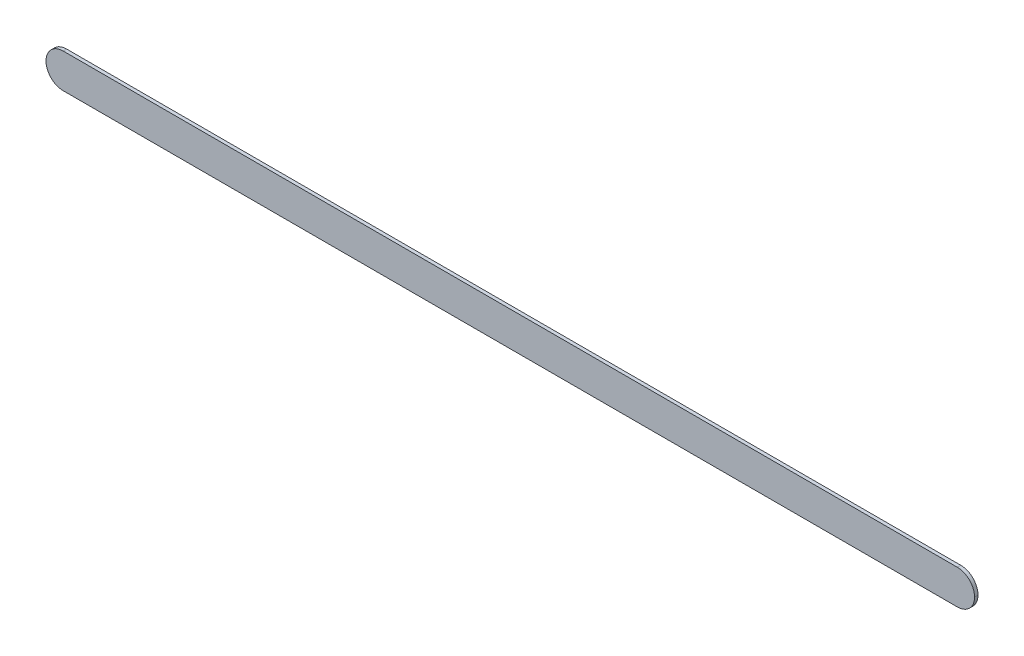
ISO-10303-21;
HEADER;
FILE_DESCRIPTION(('STEP AP214'),'2;1');
FILE_NAME('part.step','',(''),(''),'','','');
FILE_SCHEMA(('AUTOMOTIVE_DESIGN { 1 0 10303 214 1 1 1 1 }'));
ENDSEC;
DATA;
#1=APPLICATION_CONTEXT('core data for automotive mechanical design processes');
#2=APPLICATION_PROTOCOL_DEFINITION('international standard','automotive_design',2000,#1);
#3=PRODUCT_CONTEXT('',#1,'mechanical');
#4=PRODUCT('Part','Part','',(#3));
#5=PRODUCT_RELATED_PRODUCT_CATEGORY('part','',(#4));
#6=PRODUCT_DEFINITION_FORMATION('','',#4);
#7=PRODUCT_DEFINITION_CONTEXT('part definition',#1,'design');
#8=PRODUCT_DEFINITION('design','',#6,#7);
#9=PRODUCT_DEFINITION_SHAPE('','',#8);
#10=(LENGTH_UNIT() NAMED_UNIT(*) SI_UNIT(.MILLI.,.METRE.));
#11=(NAMED_UNIT(*) PLANE_ANGLE_UNIT() SI_UNIT($,.RADIAN.));
#12=(NAMED_UNIT(*) SI_UNIT($,.STERADIAN.) SOLID_ANGLE_UNIT());
#13=UNCERTAINTY_MEASURE_WITH_UNIT(LENGTH_MEASURE(1.E-05),#10,'distance_accuracy_value','');
#14=(GEOMETRIC_REPRESENTATION_CONTEXT(3) GLOBAL_UNCERTAINTY_ASSIGNED_CONTEXT((#13)) GLOBAL_UNIT_ASSIGNED_CONTEXT((#10,
#11,#12)) REPRESENTATION_CONTEXT('',''));
#15=CARTESIAN_POINT('',(0.,0.,0.));
#16=DIRECTION('',(0.,0.,1.));
#17=DIRECTION('',(1.,0.,0.));
#18=AXIS2_PLACEMENT_3D('',#15,#16,#17);
#19=CARTESIAN_POINT('',(16.299999393018,33.765999755859,0.0127));
#20=DIRECTION('',(0.,0.,1.));
#21=DIRECTION('',(1.,0.,0.));
#22=AXIS2_PLACEMENT_3D('',#19,#20,#21);
#23=PLANE('',#22);
#24=CARTESIAN_POINT('',(14.648999023438,33.765999755859,0.0127));
#25=DIRECTION('',(0.,0.,-1.));
#26=DIRECTION('',(1.,0.,0.));
#27=AXIS2_PLACEMENT_3D('',#24,#25,#26);
#28=CIRCLE('',#27,0.06349975587111);
#29=CARTESIAN_POINT('',(14.648999633789,33.7025,0.0127));
#30=VERTEX_POINT('',#29);
#31=CARTESIAN_POINT('',(14.648999023438,33.829499511725,0.0127));
#32=VERTEX_POINT('',#31);
#33=EDGE_CURVE('E112',#30,#32,#28,.T.);
#34=ORIENTED_EDGE('',*,*,#33,.F.);
#35=DIRECTION('',(1.,0.,0.));
#36=VECTOR('',#35,1.);
#37=CARTESIAN_POINT('',(17.950999755859,33.7025,0.0127));
#38=LINE('',#37,#36);
#39=CARTESIAN_POINT('',(17.950999755865,33.7025,0.0127));
#40=VERTEX_POINT('',#39);
#41=EDGE_CURVE('E79',#30,#40,#38,.T.);
#42=ORIENTED_EDGE('',*,*,#41,.T.);
#43=CARTESIAN_POINT('',(17.950999755871,33.765999755859,0.0127));
#44=DIRECTION('',(0.,0.,1.));
#45=DIRECTION('',(1.,0.,0.));
#46=AXIS2_PLACEMENT_3D('',#43,#44,#45);
#47=CIRCLE('',#46,0.06349975585938);
#48=CARTESIAN_POINT('',(18.01449951173,33.765999755859,0.0127));
#49=VERTEX_POINT('',#48);
#50=EDGE_CURVE('E104',#40,#49,#47,.T.);
#51=ORIENTED_EDGE('',*,*,#50,.T.);
#52=CARTESIAN_POINT('',(17.950999755871,33.765999755859,0.0127));
#53=DIRECTION('',(0.,0.,1.));
#54=DIRECTION('',(1.,0.,0.));
#55=AXIS2_PLACEMENT_3D('',#52,#53,#54);
#56=CIRCLE('',#55,0.06349975585938);
#57=CARTESIAN_POINT('',(17.950999755865,33.829499511719,0.0127));
#58=VERTEX_POINT('',#57);
#59=EDGE_CURVE('E83',#49,#58,#56,.T.);
#60=ORIENTED_EDGE('',*,*,#59,.T.);
#61=DIRECTION('',(-1.,0.,0.));
#62=VECTOR('',#61,1.);
#63=CARTESIAN_POINT('',(14.649000244141,33.829499511719,0.0127));
#64=LINE('',#63,#62);
#65=EDGE_CURVE('E11',#58,#32,#64,.T.);
#66=ORIENTED_EDGE('',*,*,#65,.T.);
#67=EDGE_LOOP('',(#34,#42,#51,#60,#66));
#68=FACE_BOUND('',#67,.T.);
#69=ADVANCED_FACE('F17',(#68),#23,.T.);
#70=CARTESIAN_POINT('',(14.649000244141,33.829499511719,0.));
#71=DIRECTION('',(0.,-1.,0.));
#72=DIRECTION('',(0.,0.,-1.));
#73=AXIS2_PLACEMENT_3D('',#70,#71,#72);
#74=PLANE('',#73);
#75=DIRECTION('',(0.,0.,1.));
#76=VECTOR('',#75,1.);
#77=CARTESIAN_POINT('',(17.950999755859,33.829499511719,0.));
#78=LINE('',#77,#76);
#79=CARTESIAN_POINT('',(17.950999755865,33.829499511719,0.));
#80=VERTEX_POINT('',#79);
#81=EDGE_CURVE('E135',#80,#58,#78,.T.);
#82=ORIENTED_EDGE('',*,*,#81,.F.);
#83=DIRECTION('',(-1.,0.,0.));
#84=VECTOR('',#83,1.);
#85=CARTESIAN_POINT('',(16.299999393018,33.829499511719,0.));
#86=LINE('',#85,#84);
#87=CARTESIAN_POINT('',(14.648999023438,33.829499511725,0.));
#88=VERTEX_POINT('',#87);
#89=EDGE_CURVE('E91',#80,#88,#86,.T.);
#90=ORIENTED_EDGE('',*,*,#89,.T.);
#91=DIRECTION('',(0.,0.,-1.));
#92=VECTOR('',#91,1.);
#93=CARTESIAN_POINT('',(14.648999023438,33.829499511731,0.));
#94=LINE('',#93,#92);
#95=EDGE_CURVE('E28',#32,#88,#94,.T.);
#96=ORIENTED_EDGE('',*,*,#95,.F.);
#97=ORIENTED_EDGE('',*,*,#65,.F.);
#98=EDGE_LOOP('',(#82,#90,#96,#97));
#99=FACE_BOUND('',#98,.T.);
#100=ADVANCED_FACE('F150',(#99),#74,.F.);
#101=CARTESIAN_POINT('',(14.648999023438,33.765999755859,0.));
#102=DIRECTION('',(0.,0.,1.));
#103=DIRECTION('',(1.,0.,0.));
#104=AXIS2_PLACEMENT_3D('',#101,#102,#103);
#105=CYLINDRICAL_SURFACE('',#104,0.06349975587111);
#106=DIRECTION('',(0.,0.,1.));
#107=VECTOR('',#106,1.);
#108=CARTESIAN_POINT('',(14.649000244141,33.7025,0.));
#109=LINE('',#108,#107);
#110=CARTESIAN_POINT('',(14.648999633789,33.7025,0.));
#111=VERTEX_POINT('',#110);
#112=EDGE_CURVE('E72',#111,#30,#109,.T.);
#113=ORIENTED_EDGE('',*,*,#112,.T.);
#114=ORIENTED_EDGE('',*,*,#33,.T.);
#115=ORIENTED_EDGE('',*,*,#95,.T.);
#116=CARTESIAN_POINT('',(14.648999023438,33.765999755859,0.));
#117=DIRECTION('',(0.,0.,1.));
#118=DIRECTION('',(1.,0.,0.));
#119=AXIS2_PLACEMENT_3D('',#116,#117,#118);
#120=CIRCLE('',#119,0.06349975587111);
#121=EDGE_CURVE('E86',#88,#111,#120,.T.);
#122=ORIENTED_EDGE('',*,*,#121,.T.);
#123=EDGE_LOOP('',(#113,#114,#115,#122));
#124=FACE_BOUND('',#123,.T.);
#125=ADVANCED_FACE('F19',(#124),#105,.T.);
#126=CARTESIAN_POINT('',(17.950999755859,33.7025,0.));
#127=DIRECTION('',(0.,1.,0.));
#128=DIRECTION('',(1.,0.,0.));
#129=AXIS2_PLACEMENT_3D('',#126,#127,#128);
#130=PLANE('',#129);
#131=ORIENTED_EDGE('',*,*,#112,.F.);
#132=DIRECTION('',(1.,0.,0.));
#133=VECTOR('',#132,1.);
#134=CARTESIAN_POINT('',(16.299999393018,33.7025,0.));
#135=LINE('',#134,#133);
#136=CARTESIAN_POINT('',(17.950999755865,33.7025,0.));
#137=VERTEX_POINT('',#136);
#138=EDGE_CURVE('E77',#111,#137,#135,.T.);
#139=ORIENTED_EDGE('',*,*,#138,.T.);
#140=DIRECTION('',(0.,0.,-1.));
#141=VECTOR('',#140,1.);
#142=CARTESIAN_POINT('',(17.950999755859,33.7025,0.));
#143=LINE('',#142,#141);
#144=EDGE_CURVE('E98',#40,#137,#143,.T.);
#145=ORIENTED_EDGE('',*,*,#144,.F.);
#146=ORIENTED_EDGE('',*,*,#41,.F.);
#147=EDGE_LOOP('',(#131,#139,#145,#146));
#148=FACE_BOUND('',#147,.T.);
#149=ADVANCED_FACE('F74',(#148),#130,.F.);
#150=CARTESIAN_POINT('',(17.950999755871,33.765999755859,0.));
#151=DIRECTION('',(0.,0.,1.));
#152=DIRECTION('',(1.,0.,0.));
#153=AXIS2_PLACEMENT_3D('',#150,#151,#152);
#154=CYLINDRICAL_SURFACE('',#153,0.06349975585938);
#155=DIRECTION('',(0.,0.,1.));
#156=VECTOR('',#155,1.);
#157=CARTESIAN_POINT('',(18.01449951173,33.765999755859,0.));
#158=LINE('',#157,#156);
#159=CARTESIAN_POINT('',(18.01449951173,33.765999755859,0.));
#160=VERTEX_POINT('',#159);
#161=EDGE_CURVE('E21',#160,#49,#158,.T.);
#162=ORIENTED_EDGE('',*,*,#161,.F.);
#163=CARTESIAN_POINT('',(17.950999755871,33.765999755859,0.));
#164=DIRECTION('',(0.,0.,1.));
#165=DIRECTION('',(1.,0.,0.));
#166=AXIS2_PLACEMENT_3D('',#163,#164,#165);
#167=CIRCLE('',#166,0.06349975585938);
#168=EDGE_CURVE('E132',#160,#80,#167,.T.);
#169=ORIENTED_EDGE('',*,*,#168,.T.);
#170=ORIENTED_EDGE('',*,*,#81,.T.);
#171=ORIENTED_EDGE('',*,*,#59,.F.);
#172=EDGE_LOOP('',(#162,#169,#170,#171));
#173=FACE_BOUND('',#172,.T.);
#174=ADVANCED_FACE('F156',(#173),#154,.T.);
#175=CARTESIAN_POINT('',(16.299999393018,33.765999755859,0.));
#176=DIRECTION('',(0.,0.,1.));
#177=DIRECTION('',(1.,0.,0.));
#178=AXIS2_PLACEMENT_3D('',#175,#176,#177);
#179=PLANE('',#178);
#180=ORIENTED_EDGE('',*,*,#138,.F.);
#181=ORIENTED_EDGE('',*,*,#121,.F.);
#182=ORIENTED_EDGE('',*,*,#89,.F.);
#183=ORIENTED_EDGE('',*,*,#168,.F.);
#184=CARTESIAN_POINT('',(17.950999755871,33.765999755859,0.));
#185=DIRECTION('',(0.,0.,1.));
#186=DIRECTION('',(1.,0.,0.));
#187=AXIS2_PLACEMENT_3D('',#184,#185,#186);
#188=CIRCLE('',#187,0.06349975585938);
#189=EDGE_CURVE('E96',#137,#160,#188,.T.);
#190=ORIENTED_EDGE('',*,*,#189,.F.);
#191=EDGE_LOOP('',(#180,#181,#182,#183,#190));
#192=FACE_BOUND('',#191,.T.);
#193=ADVANCED_FACE('F94',(#192),#179,.F.);
#194=CARTESIAN_POINT('',(17.950999755871,33.765999755859,0.));
#195=DIRECTION('',(0.,0.,1.));
#196=DIRECTION('',(1.,0.,0.));
#197=AXIS2_PLACEMENT_3D('',#194,#195,#196);
#198=CYLINDRICAL_SURFACE('',#197,0.06349975585938);
#199=ORIENTED_EDGE('',*,*,#189,.T.);
#200=ORIENTED_EDGE('',*,*,#161,.T.);
#201=ORIENTED_EDGE('',*,*,#50,.F.);
#202=ORIENTED_EDGE('',*,*,#144,.T.);
#203=EDGE_LOOP('',(#199,#200,#201,#202));
#204=FACE_BOUND('',#203,.T.);
#205=ADVANCED_FACE('F123',(#204),#198,.T.);
#206=CLOSED_SHELL('',(#69,#100,#125,#149,#174,#193,#205));
#207=MANIFOLD_SOLID_BREP('B1',#206);
#208=ADVANCED_BREP_SHAPE_REPRESENTATION('',(#18,#207),#14);
#209=SHAPE_DEFINITION_REPRESENTATION(#9,#208);
ENDSEC;
END-ISO-10303-21;
